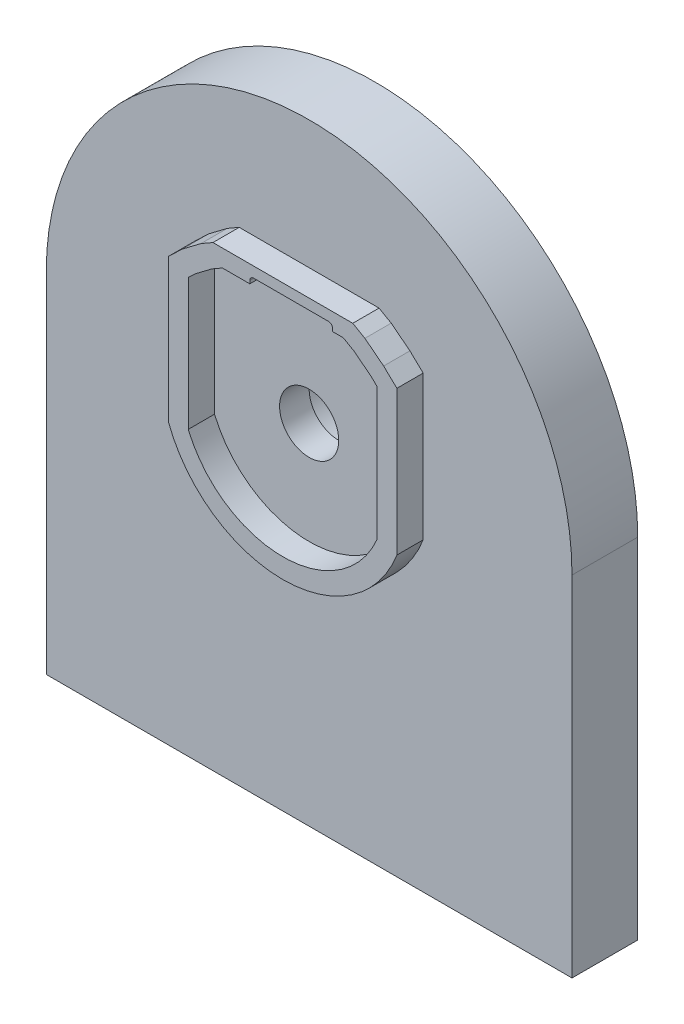
ISO-10303-21;
HEADER;
FILE_DESCRIPTION(('STEP AP214'),'2;1');
FILE_NAME('part.step','',(''),(''),'','','');
FILE_SCHEMA(('AUTOMOTIVE_DESIGN { 1 0 10303 214 1 1 1 1 }'));
ENDSEC;
DATA;
#1=APPLICATION_CONTEXT('core data for automotive mechanical design processes');
#2=APPLICATION_PROTOCOL_DEFINITION('international standard','automotive_design',2000,#1);
#3=PRODUCT_CONTEXT('',#1,'mechanical');
#4=PRODUCT('Part','Part','',(#3));
#5=PRODUCT_RELATED_PRODUCT_CATEGORY('part','',(#4));
#6=PRODUCT_DEFINITION_FORMATION('','',#4);
#7=PRODUCT_DEFINITION_CONTEXT('part definition',#1,'design');
#8=PRODUCT_DEFINITION('design','',#6,#7);
#9=PRODUCT_DEFINITION_SHAPE('','',#8);
#10=(LENGTH_UNIT() NAMED_UNIT(*) SI_UNIT(.MILLI.,.METRE.));
#11=(NAMED_UNIT(*) PLANE_ANGLE_UNIT() SI_UNIT($,.RADIAN.));
#12=(NAMED_UNIT(*) SI_UNIT($,.STERADIAN.) SOLID_ANGLE_UNIT());
#13=UNCERTAINTY_MEASURE_WITH_UNIT(LENGTH_MEASURE(1.E-05),#10,'distance_accuracy_value','');
#14=(GEOMETRIC_REPRESENTATION_CONTEXT(3) GLOBAL_UNCERTAINTY_ASSIGNED_CONTEXT((#13)) GLOBAL_UNIT_ASSIGNED_CONTEXT((#10,
#11,#12)) REPRESENTATION_CONTEXT('',''));
#15=CARTESIAN_POINT('',(0.,0.,0.));
#16=DIRECTION('',(0.,0.,1.));
#17=DIRECTION('',(1.,0.,0.));
#18=AXIS2_PLACEMENT_3D('',#15,#16,#17);
#19=CARTESIAN_POINT('',(-40.,-53.1,5.));
#20=DIRECTION('',(1.,0.,0.));
#21=DIRECTION('',(0.,0.,-1.));
#22=AXIS2_PLACEMENT_3D('',#19,#20,#21);
#23=PLANE('',#22);
#24=DIRECTION('',(0.,0.,-1.));
#25=VECTOR('',#24,1.);
#26=CARTESIAN_POINT('',(-40.,0.,9.001));
#27=LINE('',#26,#25);
#28=CARTESIAN_POINT('',(-40.,0.,5.));
#29=VERTEX_POINT('',#28);
#30=CARTESIAN_POINT('',(-40.,0.,-5.));
#31=VERTEX_POINT('',#30);
#32=EDGE_CURVE('E235',#29,#31,#27,.T.);
#33=ORIENTED_EDGE('',*,*,#32,.T.);
#34=DIRECTION('',(0.,-1.,0.));
#35=VECTOR('',#34,1.);
#36=CARTESIAN_POINT('',(-40.,-53.1,-5.));
#37=LINE('',#36,#35);
#38=CARTESIAN_POINT('',(-40.,-53.1,-5.));
#39=VERTEX_POINT('',#38);
#40=EDGE_CURVE('E246',#31,#39,#37,.T.);
#41=ORIENTED_EDGE('',*,*,#40,.T.);
#42=DIRECTION('',(0.,0.,-1.));
#43=VECTOR('',#42,1.);
#44=CARTESIAN_POINT('',(-40.,-53.1,5.));
#45=LINE('',#44,#43);
#46=CARTESIAN_POINT('',(-40.,-53.1,5.));
#47=VERTEX_POINT('',#46);
#48=EDGE_CURVE('E11',#47,#39,#45,.T.);
#49=ORIENTED_EDGE('',*,*,#48,.F.);
#50=DIRECTION('',(0.,-1.,0.));
#51=VECTOR('',#50,1.);
#52=CARTESIAN_POINT('',(-40.,-53.1,5.));
#53=LINE('',#52,#51);
#54=EDGE_CURVE('E248',#29,#47,#53,.T.);
#55=ORIENTED_EDGE('',*,*,#54,.F.);
#56=EDGE_LOOP('',(#33,#41,#49,#55));
#57=FACE_BOUND('',#56,.T.);
#58=ADVANCED_FACE('F37',(#57),#23,.F.);
#59=CARTESIAN_POINT('',(0.,0.,-5.001));
#60=DIRECTION('',(0.,0.,1.));
#61=DIRECTION('',(1.,0.,0.));
#62=AXIS2_PLACEMENT_3D('',#59,#60,#61);
#63=CYLINDRICAL_SURFACE('',#62,4.5);
#64=CARTESIAN_POINT('',(0.,0.,5.));
#65=DIRECTION('',(0.,0.,1.));
#66=DIRECTION('',(1.,0.,0.));
#67=AXIS2_PLACEMENT_3D('',#64,#65,#66);
#68=CIRCLE('',#67,4.5);
#69=CARTESIAN_POINT('',(4.5,0.,5.));
#70=VERTEX_POINT('',#69);
#71=EDGE_CURVE('E422',#70,#70,#68,.T.);
#72=ORIENTED_EDGE('',*,*,#71,.T.);
#73=EDGE_LOOP('',(#72));
#74=FACE_BOUND('',#73,.T.);
#75=CARTESIAN_POINT('',(0.,0.,0.5));
#76=DIRECTION('',(0.,0.,-1.));
#77=DIRECTION('',(-1.,0.,0.));
#78=AXIS2_PLACEMENT_3D('',#75,#76,#77);
#79=CIRCLE('',#78,4.5);
#80=CARTESIAN_POINT('',(-4.5,0.,0.5));
#81=VERTEX_POINT('',#80);
#82=EDGE_CURVE('E40',#81,#81,#79,.F.);
#83=ORIENTED_EDGE('',*,*,#82,.F.);
#84=EDGE_LOOP('',(#83));
#85=FACE_BOUND('',#84,.T.);
#86=ADVANCED_FACE('F477',(#74,#85),#63,.F.);
#87=CARTESIAN_POINT('',(0.,0.,5.));
#88=DIRECTION('',(0.,0.,1.));
#89=DIRECTION('',(1.,0.,0.));
#90=AXIS2_PLACEMENT_3D('',#87,#88,#89);
#91=PLANE('',#90);
#92=CARTESIAN_POINT('',(0.,0.,5.));
#93=DIRECTION('',(0.,0.,1.));
#94=DIRECTION('',(1.,0.,0.));
#95=AXIS2_PLACEMENT_3D('',#92,#93,#94);
#96=CIRCLE('',#95,40.);
#97=CARTESIAN_POINT('',(40.,0.,5.));
#98=VERTEX_POINT('',#97);
#99=EDGE_CURVE('E241',#98,#29,#96,.T.);
#100=ORIENTED_EDGE('',*,*,#99,.T.);
#101=ORIENTED_EDGE('',*,*,#54,.T.);
#102=DIRECTION('',(1.,0.,0.));
#103=VECTOR('',#102,1.);
#104=CARTESIAN_POINT('',(40.,-53.1,5.));
#105=LINE('',#104,#103);
#106=CARTESIAN_POINT('',(40.,-53.1,5.));
#107=VERTEX_POINT('',#106);
#108=EDGE_CURVE('E269',#47,#107,#105,.T.);
#109=ORIENTED_EDGE('',*,*,#108,.T.);
#110=DIRECTION('',(0.,1.,0.));
#111=VECTOR('',#110,1.);
#112=CARTESIAN_POINT('',(40.,-53.1,5.));
#113=LINE('',#112,#111);
#114=EDGE_CURVE('E260',#107,#98,#113,.T.);
#115=ORIENTED_EDGE('',*,*,#114,.T.);
#116=EDGE_LOOP('',(#100,#101,#109,#115));
#117=FACE_BOUND('',#116,.T.);
#118=DIRECTION('',(0.,1.,0.));
#119=VECTOR('',#118,1.);
#120=CARTESIAN_POINT('',(17.3516494747997,15.2879994287768,5.));
#121=LINE('',#120,#119);
#122=CARTESIAN_POINT('',(17.3516494747997,-6.68617710781678,5.));
#123=VERTEX_POINT('',#122);
#124=CARTESIAN_POINT('',(17.3516494747997,15.2879994287768,5.));
#125=VERTEX_POINT('',#124);
#126=EDGE_CURVE('E316',#123,#125,#121,.T.);
#127=ORIENTED_EDGE('',*,*,#126,.F.);
#128=CARTESIAN_POINT('',(0.,0.,5.));
#129=DIRECTION('',(0.,0.,1.));
#130=DIRECTION('',(1.,0.,0.));
#131=AXIS2_PLACEMENT_3D('',#128,#129,#130);
#132=CIRCLE('',#131,18.5952871398483);
#133=CARTESIAN_POINT('',(-17.395287132,-6.57181020790196,5.));
#134=VERTEX_POINT('',#133);
#135=EDGE_CURVE('E318',#134,#123,#132,.T.);
#136=ORIENTED_EDGE('',*,*,#135,.F.);
#137=DIRECTION('',(0.,-1.,0.));
#138=VECTOR('',#137,1.);
#139=CARTESIAN_POINT('',(-17.395287132,-6.57181020790196,5.));
#140=LINE('',#139,#138);
#141=CARTESIAN_POINT('',(-17.395287132,15.3071578483043,5.));
#142=VERTEX_POINT('',#141);
#143=EDGE_CURVE('E299',#142,#134,#140,.T.);
#144=ORIENTED_EDGE('',*,*,#143,.F.);
#145=DIRECTION('',(-0.723392576246225,-0.690436949063308,0.));
#146=VECTOR('',#145,1.);
#147=CARTESIAN_POINT('',(-17.395287132,15.3071578483043,5.));
#148=LINE('',#147,#146);
#149=CARTESIAN_POINT('',(-15.3110997737798,17.2963957920402,5.));
#150=VERTEX_POINT('',#149);
#151=EDGE_CURVE('E302',#150,#142,#148,.T.);
#152=ORIENTED_EDGE('',*,*,#151,.F.);
#153=DIRECTION('',(-0.797562130812441,-0.603236808802248,0.));
#154=VECTOR('',#153,1.);
#155=CARTESIAN_POINT('',(-12.4618544798575,19.4514249392361,5.));
#156=LINE('',#155,#154);
#157=CARTESIAN_POINT('',(-12.4618544798575,19.4514249392361,5.));
#158=VERTEX_POINT('',#157);
#159=EDGE_CURVE('E304',#158,#150,#156,.T.);
#160=ORIENTED_EDGE('',*,*,#159,.F.);
#161=DIRECTION('',(-0.866775184484499,-0.498699087187718,0.));
#162=VECTOR('',#161,1.);
#163=CARTESIAN_POINT('',(-12.4618544798575,19.4514249392361,5.));
#164=LINE('',#163,#162);
#165=CARTESIAN_POINT('',(-10.6393549704544,20.4999999999999,5.));
#166=VERTEX_POINT('',#165);
#167=EDGE_CURVE('E306',#166,#158,#164,.T.);
#168=ORIENTED_EDGE('',*,*,#167,.F.);
#169=DIRECTION('',(-1.,0.,0.));
#170=VECTOR('',#169,1.);
#171=CARTESIAN_POINT('',(-10.6393549704544,20.4999999999999,5.));
#172=LINE('',#171,#170);
#173=CARTESIAN_POINT('',(10.6393549672045,20.5,5.));
#174=VERTEX_POINT('',#173);
#175=EDGE_CURVE('E308',#174,#166,#172,.T.);
#176=ORIENTED_EDGE('',*,*,#175,.F.);
#177=DIRECTION('',(-0.866775184909779,0.49869908644855,0.));
#178=VECTOR('',#177,1.);
#179=CARTESIAN_POINT('',(10.6393549672045,20.5,5.));
#180=LINE('',#179,#178);
#181=CARTESIAN_POINT('',(12.4815467335809,19.4400950016231,5.));
#182=VERTEX_POINT('',#181);
#183=EDGE_CURVE('E310',#182,#174,#180,.T.);
#184=ORIENTED_EDGE('',*,*,#183,.F.);
#185=DIRECTION('',(-0.788674571599322,0.614810881582806,0.));
#186=VECTOR('',#185,1.);
#187=CARTESIAN_POINT('',(12.4815467335809,19.4400950016231,5.));
#188=LINE('',#187,#186);
#189=CARTESIAN_POINT('',(15.3346635634229,17.2159491541707,5.));
#190=VERTEX_POINT('',#189);
#191=EDGE_CURVE('E312',#190,#182,#188,.T.);
#192=ORIENTED_EDGE('',*,*,#191,.F.);
#193=DIRECTION('',(-0.722881907791822,0.690971596657384,0.));
#194=VECTOR('',#193,1.);
#195=CARTESIAN_POINT('',(15.3346635634229,17.2159491541707,5.));
#196=LINE('',#195,#194);
#197=EDGE_CURVE('E314',#125,#190,#196,.T.);
#198=ORIENTED_EDGE('',*,*,#197,.F.);
#199=EDGE_LOOP('',(#127,#136,#144,#152,#160,#168,#176,#184,#192,#198));
#200=FACE_BOUND('',#199,.T.);
#201=ADVANCED_FACE('F462',(#117,#200),#91,.T.);
#202=CARTESIAN_POINT('',(40.,-53.1,5.));
#203=DIRECTION('',(0.,1.,0.));
#204=DIRECTION('',(-1.,0.,0.));
#205=AXIS2_PLACEMENT_3D('',#202,#203,#204);
#206=PLANE('',#205);
#207=DIRECTION('',(1.,0.,0.));
#208=VECTOR('',#207,1.);
#209=CARTESIAN_POINT('',(40.,-53.1,-5.));
#210=LINE('',#209,#208);
#211=CARTESIAN_POINT('',(40.,-53.1,-5.));
#212=VERTEX_POINT('',#211);
#213=EDGE_CURVE('E252',#39,#212,#210,.T.);
#214=ORIENTED_EDGE('',*,*,#213,.T.);
#215=DIRECTION('',(0.,0.,-1.));
#216=VECTOR('',#215,1.);
#217=CARTESIAN_POINT('',(40.,-53.1,5.));
#218=LINE('',#217,#216);
#219=EDGE_CURVE('E45',#107,#212,#218,.T.);
#220=ORIENTED_EDGE('',*,*,#219,.F.);
#221=ORIENTED_EDGE('',*,*,#108,.F.);
#222=ORIENTED_EDGE('',*,*,#48,.T.);
#223=EDGE_LOOP('',(#214,#220,#221,#222));
#224=FACE_BOUND('',#223,.T.);
#225=ADVANCED_FACE('F466',(#224),#206,.F.);
#226=CARTESIAN_POINT('',(40.,-53.1,5.));
#227=DIRECTION('',(-1.,0.,0.));
#228=DIRECTION('',(0.,0.,1.));
#229=AXIS2_PLACEMENT_3D('',#226,#227,#228);
#230=PLANE('',#229);
#231=DIRECTION('',(0.,1.,0.));
#232=VECTOR('',#231,1.);
#233=CARTESIAN_POINT('',(40.,-53.1,-5.));
#234=LINE('',#233,#232);
#235=CARTESIAN_POINT('',(40.,0.,-5.));
#236=VERTEX_POINT('',#235);
#237=EDGE_CURVE('E255',#212,#236,#234,.T.);
#238=ORIENTED_EDGE('',*,*,#237,.T.);
#239=DIRECTION('',(0.,0.,-1.));
#240=VECTOR('',#239,1.);
#241=CARTESIAN_POINT('',(40.,0.,9.001));
#242=LINE('',#241,#240);
#243=EDGE_CURVE('E52',#98,#236,#242,.T.);
#244=ORIENTED_EDGE('',*,*,#243,.F.);
#245=ORIENTED_EDGE('',*,*,#114,.F.);
#246=ORIENTED_EDGE('',*,*,#219,.T.);
#247=EDGE_LOOP('',(#238,#244,#245,#246));
#248=FACE_BOUND('',#247,.T.);
#249=ADVANCED_FACE('F464',(#248),#230,.F.);
#250=CARTESIAN_POINT('',(0.,0.,-5.));
#251=DIRECTION('',(0.,0.,1.));
#252=DIRECTION('',(1.,0.,0.));
#253=AXIS2_PLACEMENT_3D('',#250,#251,#252);
#254=PLANE('',#253);
#255=CARTESIAN_POINT('',(0.,0.,-5.));
#256=DIRECTION('',(0.,0.,-1.));
#257=DIRECTION('',(-1.,0.,0.));
#258=AXIS2_PLACEMENT_3D('',#255,#256,#257);
#259=CIRCLE('',#258,7.75);
#260=CARTESIAN_POINT('',(-7.75,0.,-5.));
#261=VERTEX_POINT('',#260);
#262=EDGE_CURVE('E249',#261,#261,#259,.T.);
#263=ORIENTED_EDGE('',*,*,#262,.F.);
#264=EDGE_LOOP('',(#263));
#265=FACE_BOUND('',#264,.T.);
#266=ORIENTED_EDGE('',*,*,#40,.F.);
#267=CARTESIAN_POINT('',(0.,0.,-5.));
#268=DIRECTION('',(0.,0.,1.));
#269=DIRECTION('',(1.,0.,0.));
#270=AXIS2_PLACEMENT_3D('',#267,#268,#269);
#271=CIRCLE('',#270,40.);
#272=EDGE_CURVE('E232',#236,#31,#271,.T.);
#273=ORIENTED_EDGE('',*,*,#272,.F.);
#274=ORIENTED_EDGE('',*,*,#237,.F.);
#275=ORIENTED_EDGE('',*,*,#213,.F.);
#276=EDGE_LOOP('',(#266,#273,#274,#275));
#277=FACE_BOUND('',#276,.T.);
#278=ADVANCED_FACE('F251',(#265,#277),#254,.F.);
#279=CARTESIAN_POINT('',(0.,0.,9.));
#280=DIRECTION('',(0.,0.,1.));
#281=DIRECTION('',(1.,0.,0.));
#282=AXIS2_PLACEMENT_3D('',#279,#280,#281);
#283=PLANE('',#282);
#284=CARTESIAN_POINT('',(0.,0.,9.));
#285=DIRECTION('',(0.,0.,1.));
#286=DIRECTION('',(1.,0.,0.));
#287=AXIS2_PLACEMENT_3D('',#284,#285,#286);
#288=CIRCLE('',#287,18.5952871398483);
#289=CARTESIAN_POINT('',(-17.395287132,-6.57181020790196,9.));
#290=VERTEX_POINT('',#289);
#291=CARTESIAN_POINT('',(17.3516494747997,-6.68617710781678,9.));
#292=VERTEX_POINT('',#291);
#293=EDGE_CURVE('E301',#290,#292,#288,.T.);
#294=ORIENTED_EDGE('',*,*,#293,.T.);
#295=DIRECTION('',(0.,1.,0.));
#296=VECTOR('',#295,1.);
#297=CARTESIAN_POINT('',(17.3516494747997,15.2879994287768,9.));
#298=LINE('',#297,#296);
#299=CARTESIAN_POINT('',(17.3516494747997,15.2879994287768,9.));
#300=VERTEX_POINT('',#299);
#301=EDGE_CURVE('E337',#292,#300,#298,.T.);
#302=ORIENTED_EDGE('',*,*,#301,.T.);
#303=DIRECTION('',(-0.722881907791822,0.690971596657384,0.));
#304=VECTOR('',#303,1.);
#305=CARTESIAN_POINT('',(15.3346635634229,17.2159491541707,9.));
#306=LINE('',#305,#304);
#307=CARTESIAN_POINT('',(15.3346635634229,17.2159491541707,9.));
#308=VERTEX_POINT('',#307);
#309=EDGE_CURVE('E335',#300,#308,#306,.T.);
#310=ORIENTED_EDGE('',*,*,#309,.T.);
#311=DIRECTION('',(-0.788674571599322,0.614810881582806,0.));
#312=VECTOR('',#311,1.);
#313=CARTESIAN_POINT('',(12.4815467335809,19.4400950016231,9.));
#314=LINE('',#313,#312);
#315=CARTESIAN_POINT('',(12.4815467335809,19.4400950016231,9.));
#316=VERTEX_POINT('',#315);
#317=EDGE_CURVE('E333',#308,#316,#314,.T.);
#318=ORIENTED_EDGE('',*,*,#317,.T.);
#319=DIRECTION('',(-0.866775184909779,0.49869908644855,0.));
#320=VECTOR('',#319,1.);
#321=CARTESIAN_POINT('',(10.6393549672045,20.5,9.));
#322=LINE('',#321,#320);
#323=CARTESIAN_POINT('',(10.6393549672045,20.5,9.));
#324=VERTEX_POINT('',#323);
#325=EDGE_CURVE('E331',#316,#324,#322,.T.);
#326=ORIENTED_EDGE('',*,*,#325,.T.);
#327=DIRECTION('',(-1.,0.,0.));
#328=VECTOR('',#327,1.);
#329=CARTESIAN_POINT('',(-10.6393549704544,20.4999999999999,9.));
#330=LINE('',#329,#328);
#331=CARTESIAN_POINT('',(-10.6393549704544,20.4999999999999,9.));
#332=VERTEX_POINT('',#331);
#333=EDGE_CURVE('E329',#324,#332,#330,.T.);
#334=ORIENTED_EDGE('',*,*,#333,.T.);
#335=DIRECTION('',(-0.866775184484499,-0.498699087187718,0.));
#336=VECTOR('',#335,1.);
#337=CARTESIAN_POINT('',(-12.4618544798575,19.4514249392361,9.));
#338=LINE('',#337,#336);
#339=CARTESIAN_POINT('',(-12.4618544798575,19.4514249392361,9.));
#340=VERTEX_POINT('',#339);
#341=EDGE_CURVE('E327',#332,#340,#338,.T.);
#342=ORIENTED_EDGE('',*,*,#341,.T.);
#343=DIRECTION('',(-0.797562130812441,-0.603236808802248,0.));
#344=VECTOR('',#343,1.);
#345=CARTESIAN_POINT('',(-12.4618544798575,19.4514249392361,9.));
#346=LINE('',#345,#344);
#347=CARTESIAN_POINT('',(-15.3110997737798,17.2963957920402,9.));
#348=VERTEX_POINT('',#347);
#349=EDGE_CURVE('E325',#340,#348,#346,.T.);
#350=ORIENTED_EDGE('',*,*,#349,.T.);
#351=DIRECTION('',(-0.723392576246225,-0.690436949063308,0.));
#352=VECTOR('',#351,1.);
#353=CARTESIAN_POINT('',(-17.395287132,15.3071578483043,9.));
#354=LINE('',#353,#352);
#355=CARTESIAN_POINT('',(-17.395287132,15.3071578483043,9.));
#356=VERTEX_POINT('',#355);
#357=EDGE_CURVE('E323',#348,#356,#354,.T.);
#358=ORIENTED_EDGE('',*,*,#357,.T.);
#359=DIRECTION('',(0.,-1.,0.));
#360=VECTOR('',#359,1.);
#361=CARTESIAN_POINT('',(-17.395287132,-6.57181020790196,9.));
#362=LINE('',#361,#360);
#363=EDGE_CURVE('E298',#356,#290,#362,.T.);
#364=ORIENTED_EDGE('',*,*,#363,.T.);
#365=EDGE_LOOP('',(#294,#302,#310,#318,#326,#334,#342,#350,#358,#364));
#366=FACE_BOUND('',#365,.T.);
#367=DIRECTION('',(0.,1.,0.));
#368=VECTOR('',#367,1.);
#369=CARTESIAN_POINT('',(14.3516494747997,14.0055144197664,9.));
#370=LINE('',#369,#368);
#371=CARTESIAN_POINT('',(14.3516494747997,-6.10271565180623,9.));
#372=VERTEX_POINT('',#371);
#373=CARTESIAN_POINT('',(14.3516494747997,14.0055144197664,9.));
#374=VERTEX_POINT('',#373);
#375=EDGE_CURVE('E451',#372,#374,#370,.T.);
#376=ORIENTED_EDGE('',*,*,#375,.F.);
#377=CARTESIAN_POINT('',(0.,0.,9.));
#378=DIRECTION('',(0.,0.,1.));
#379=DIRECTION('',(1.,0.,0.));
#380=AXIS2_PLACEMENT_3D('',#377,#378,#379);
#381=CIRCLE('',#380,15.5952871398484);
#382=CARTESIAN_POINT('',(-14.395287132,-5.99905737275405,9.));
#383=VERTEX_POINT('',#382);
#384=EDGE_CURVE('E391',#383,#372,#381,.T.);
#385=ORIENTED_EDGE('',*,*,#384,.F.);
#386=DIRECTION('',(0.,-1.,0.));
#387=VECTOR('',#386,1.);
#388=CARTESIAN_POINT('',(-14.395287132,-5.99905737275405,9.));
#389=LINE('',#388,#387);
#390=CARTESIAN_POINT('',(-14.395287132,14.02336094009,9.));
#391=VERTEX_POINT('',#390);
#392=EDGE_CURVE('E388',#391,#383,#389,.T.);
#393=ORIENTED_EDGE('',*,*,#392,.F.);
#394=DIRECTION('',(-0.723392576246216,-0.690436949063318,0.));
#395=VECTOR('',#394,1.);
#396=CARTESIAN_POINT('',(-14.395287132,14.02336094009,9.));
#397=LINE('',#396,#395);
#398=CARTESIAN_POINT('',(-13.3642106476702,15.0074646280014,9.));
#399=VERTEX_POINT('',#398);
#400=EDGE_CURVE('E424',#399,#391,#397,.T.);
#401=ORIENTED_EDGE('',*,*,#400,.F.);
#402=DIRECTION('',(-0.797562130812442,-0.603236808802245,0.));
#403=VECTOR('',#402,1.);
#404=CARTESIAN_POINT('',(-10.8024296846773,16.9450698793841,9.));
#405=LINE('',#404,#403);
#406=CARTESIAN_POINT('',(-10.8024296846773,16.9450698793841,9.));
#407=VERTEX_POINT('',#406);
#408=EDGE_CURVE('E427',#407,#399,#405,.T.);
#409=ORIENTED_EDGE('',*,*,#408,.F.);
#410=DIRECTION('',(-0.866775184484492,-0.498699087187729,0.));
#411=VECTOR('',#410,1.);
#412=CARTESIAN_POINT('',(-10.8024296846773,16.9450698793841,9.));
#413=LINE('',#412,#411);
#414=CARTESIAN_POINT('',(-9.20235605248733,17.8656722155953,9.));
#415=VERTEX_POINT('',#414);
#416=EDGE_CURVE('E429',#415,#407,#413,.T.);
#417=ORIENTED_EDGE('',*,*,#416,.F.);
#418=DIRECTION('',(-1.,0.,0.));
#419=VECTOR('',#418,1.);
#420=CARTESIAN_POINT('',(-9.20235605248733,17.8656722155953,9.));
#421=LINE('',#420,#419);
#422=CARTESIAN_POINT('',(-5.02528712683671,17.8656722155953,9.));
#423=VERTEX_POINT('',#422);
#424=EDGE_CURVE('E431',#423,#415,#421,.T.);
#425=ORIENTED_EDGE('',*,*,#424,.F.);
#426=DIRECTION('',(0.,-1.,0.));
#427=VECTOR('',#426,1.);
#428=CARTESIAN_POINT('',(-5.02528712683671,17.8656722155953,9.));
#429=LINE('',#428,#427);
#430=CARTESIAN_POINT('',(-5.02528712683671,18.3079082550131,9.));
#431=VERTEX_POINT('',#430);
#432=EDGE_CURVE('E433',#431,#423,#429,.T.);
#433=ORIENTED_EDGE('',*,*,#432,.F.);
#434=CARTESIAN_POINT('',(-4.43010720618557,18.3079082550131,9.));
#435=DIRECTION('',(0.,0.,1.));
#436=DIRECTION('',(-1.,0.,0.));
#437=AXIS2_PLACEMENT_3D('',#434,#435,#436);
#438=CIRCLE('',#437,0.595179920651143);
#439=CARTESIAN_POINT('',(-4.43010720618557,18.9030881756642,9.));
#440=VERTEX_POINT('',#439);
#441=EDGE_CURVE('E435',#440,#431,#438,.T.);
#442=ORIENTED_EDGE('',*,*,#441,.F.);
#443=DIRECTION('',(-1.,0.,0.));
#444=VECTOR('',#443,1.);
#445=CARTESIAN_POINT('',(-4.43010720618557,18.9030881756642,9.));
#446=LINE('',#445,#444);
#447=CARTESIAN_POINT('',(6.97010720783005,18.9030881756642,9.));
#448=VERTEX_POINT('',#447);
#449=EDGE_CURVE('E437',#448,#440,#446,.T.);
#450=ORIENTED_EDGE('',*,*,#449,.F.);
#451=CARTESIAN_POINT('',(6.97010720783004,18.3079082554086,9.));
#452=DIRECTION('',(0.,0.,1.));
#453=DIRECTION('',(-1.,0.,0.));
#454=AXIS2_PLACEMENT_3D('',#451,#452,#453);
#455=CIRCLE('',#454,0.595179920255596);
#456=CARTESIAN_POINT('',(7.56528712808564,18.3079082554086,9.));
#457=VERTEX_POINT('',#456);
#458=EDGE_CURVE('E439',#457,#448,#455,.T.);
#459=ORIENTED_EDGE('',*,*,#458,.F.);
#460=DIRECTION('',(-1.17678568895622E-13,1.,0.));
#461=VECTOR('',#460,1.);
#462=CARTESIAN_POINT('',(7.56528712808564,18.3079082554086,9.));
#463=LINE('',#462,#461);
#464=CARTESIAN_POINT('',(7.56528712808569,17.8656722155953,9.));
#465=VERTEX_POINT('',#464);
#466=EDGE_CURVE('E441',#465,#457,#463,.T.);
#467=ORIENTED_EDGE('',*,*,#466,.F.);
#468=DIRECTION('',(-1.,0.,0.));
#469=VECTOR('',#468,1.);
#470=CARTESIAN_POINT('',(7.56528712808569,17.8656722155953,9.));
#471=LINE('',#470,#469);
#472=CARTESIAN_POINT('',(9.20235604935411,17.8656722155953,9.));
#473=VERTEX_POINT('',#472);
#474=EDGE_CURVE('E443',#473,#465,#471,.T.);
#475=ORIENTED_EDGE('',*,*,#474,.F.);
#476=DIRECTION('',(-0.86677518490977,0.498699086448565,0.));
#477=VECTOR('',#476,1.);
#478=CARTESIAN_POINT('',(9.20235604935411,17.8656722155953,9.));
#479=LINE('',#478,#477);
#480=CARTESIAN_POINT('',(10.803064918675,16.9447043975289,9.));
#481=VERTEX_POINT('',#480);
#482=EDGE_CURVE('E445',#481,#473,#479,.T.);
#483=ORIENTED_EDGE('',*,*,#482,.F.);
#484=DIRECTION('',(-0.788674571599326,0.614810881582801,0.));
#485=VECTOR('',#484,1.);
#486=CARTESIAN_POINT('',(10.803064918675,16.9447043975289,9.));
#487=LINE('',#486,#485);
#488=CARTESIAN_POINT('',(13.37101733952,14.9428583274562,9.));
#489=VERTEX_POINT('',#488);
#490=EDGE_CURVE('E447',#489,#481,#487,.T.);
#491=ORIENTED_EDGE('',*,*,#490,.F.);
#492=DIRECTION('',(-0.722881907791822,0.690971596657385,0.));
#493=VECTOR('',#492,1.);
#494=CARTESIAN_POINT('',(13.37101733952,14.9428583274562,9.));
#495=LINE('',#494,#493);
#496=EDGE_CURVE('E449',#374,#489,#495,.T.);
#497=ORIENTED_EDGE('',*,*,#496,.F.);
#498=EDGE_LOOP('',(#376,#385,#393,#401,#409,#417,#425,#433,#442,#450,#459,#467,#475,#483,#491,#497));
#499=FACE_BOUND('',#498,.T.);
#500=ADVANCED_FACE('F472',(#366,#499),#283,.T.);
#501=CARTESIAN_POINT('',(0.,0.,9.));
#502=DIRECTION('',(0.,0.,-1.));
#503=DIRECTION('',(-1.,0.,0.));
#504=AXIS2_PLACEMENT_3D('',#501,#502,#503);
#505=CYLINDRICAL_SURFACE('',#504,18.5952871398483);
#506=ORIENTED_EDGE('',*,*,#135,.T.);
#507=DIRECTION('',(0.,0.,-1.));
#508=VECTOR('',#507,1.);
#509=CARTESIAN_POINT('',(17.3516494747997,-6.68617710781678,9.));
#510=LINE('',#509,#508);
#511=EDGE_CURVE('E253',#292,#123,#510,.T.);
#512=ORIENTED_EDGE('',*,*,#511,.F.);
#513=ORIENTED_EDGE('',*,*,#293,.F.);
#514=DIRECTION('',(0.,0.,-1.));
#515=VECTOR('',#514,1.);
#516=CARTESIAN_POINT('',(-17.395287132,-6.57181020790196,9.));
#517=LINE('',#516,#515);
#518=EDGE_CURVE('E295',#290,#134,#517,.T.);
#519=ORIENTED_EDGE('',*,*,#518,.T.);
#520=EDGE_LOOP('',(#506,#512,#513,#519));
#521=FACE_BOUND('',#520,.T.);
#522=ADVANCED_FACE('F560',(#521),#505,.T.);
#523=CARTESIAN_POINT('',(17.3516494747997,15.2879994287768,9.));
#524=DIRECTION('',(-1.,0.,0.));
#525=DIRECTION('',(0.,0.,1.));
#526=AXIS2_PLACEMENT_3D('',#523,#524,#525);
#527=PLANE('',#526);
#528=ORIENTED_EDGE('',*,*,#126,.T.);
#529=DIRECTION('',(0.,0.,-1.));
#530=VECTOR('',#529,1.);
#531=CARTESIAN_POINT('',(17.3516494747997,15.2879994287768,9.));
#532=LINE('',#531,#530);
#533=EDGE_CURVE('E257',#300,#125,#532,.T.);
#534=ORIENTED_EDGE('',*,*,#533,.F.);
#535=ORIENTED_EDGE('',*,*,#301,.F.);
#536=ORIENTED_EDGE('',*,*,#511,.T.);
#537=EDGE_LOOP('',(#528,#534,#535,#536));
#538=FACE_BOUND('',#537,.T.);
#539=ADVANCED_FACE('F591',(#538),#527,.F.);
#540=CARTESIAN_POINT('',(15.3346635634229,17.2159491541707,9.));
#541=DIRECTION('',(-0.690971596657384,-0.722881907791823,0.));
#542=DIRECTION('',(0.722881907791823,-0.690971596657384,0.));
#543=AXIS2_PLACEMENT_3D('',#540,#541,#542);
#544=PLANE('',#543);
#545=ORIENTED_EDGE('',*,*,#197,.T.);
#546=DIRECTION('',(0.,0.,-1.));
#547=VECTOR('',#546,1.);
#548=CARTESIAN_POINT('',(15.3346635634229,17.2159491541707,9.));
#549=LINE('',#548,#547);
#550=EDGE_CURVE('E276',#308,#190,#549,.T.);
#551=ORIENTED_EDGE('',*,*,#550,.F.);
#552=ORIENTED_EDGE('',*,*,#309,.F.);
#553=ORIENTED_EDGE('',*,*,#533,.T.);
#554=EDGE_LOOP('',(#545,#551,#552,#553));
#555=FACE_BOUND('',#554,.T.);
#556=ADVANCED_FACE('F587',(#555),#544,.F.);
#557=CARTESIAN_POINT('',(12.4815467335809,19.4400950016231,9.));
#558=DIRECTION('',(-0.614810881582806,-0.788674571599322,0.));
#559=DIRECTION('',(0.788674571599322,-0.614810881582806,0.));
#560=AXIS2_PLACEMENT_3D('',#557,#558,#559);
#561=PLANE('',#560);
#562=ORIENTED_EDGE('',*,*,#191,.T.);
#563=DIRECTION('',(0.,0.,-1.));
#564=VECTOR('',#563,1.);
#565=CARTESIAN_POINT('',(12.4815467335809,19.4400950016231,9.));
#566=LINE('',#565,#564);
#567=EDGE_CURVE('E279',#316,#182,#566,.T.);
#568=ORIENTED_EDGE('',*,*,#567,.F.);
#569=ORIENTED_EDGE('',*,*,#317,.F.);
#570=ORIENTED_EDGE('',*,*,#550,.T.);
#571=EDGE_LOOP('',(#562,#568,#569,#570));
#572=FACE_BOUND('',#571,.T.);
#573=ADVANCED_FACE('F583',(#572),#561,.F.);
#574=CARTESIAN_POINT('',(10.6393549672045,20.5,9.));
#575=DIRECTION('',(-0.49869908644855,-0.866775184909779,0.));
#576=DIRECTION('',(0.866775184909779,-0.49869908644855,0.));
#577=AXIS2_PLACEMENT_3D('',#574,#575,#576);
#578=PLANE('',#577);
#579=ORIENTED_EDGE('',*,*,#183,.T.);
#580=DIRECTION('',(0.,0.,-1.));
#581=VECTOR('',#580,1.);
#582=CARTESIAN_POINT('',(10.6393549672045,20.5,9.));
#583=LINE('',#582,#581);
#584=EDGE_CURVE('E282',#324,#174,#583,.T.);
#585=ORIENTED_EDGE('',*,*,#584,.F.);
#586=ORIENTED_EDGE('',*,*,#325,.F.);
#587=ORIENTED_EDGE('',*,*,#567,.T.);
#588=EDGE_LOOP('',(#579,#585,#586,#587));
#589=FACE_BOUND('',#588,.T.);
#590=ADVANCED_FACE('F579',(#589),#578,.F.);
#591=CARTESIAN_POINT('',(-10.6393549704544,20.4999999999999,9.));
#592=DIRECTION('',(0.,-1.,0.));
#593=DIRECTION('',(1.,0.,0.));
#594=AXIS2_PLACEMENT_3D('',#591,#592,#593);
#595=PLANE('',#594);
#596=ORIENTED_EDGE('',*,*,#175,.T.);
#597=DIRECTION('',(0.,0.,-1.));
#598=VECTOR('',#597,1.);
#599=CARTESIAN_POINT('',(-10.6393549704544,20.4999999999999,9.));
#600=LINE('',#599,#598);
#601=EDGE_CURVE('E285',#332,#166,#600,.T.);
#602=ORIENTED_EDGE('',*,*,#601,.F.);
#603=ORIENTED_EDGE('',*,*,#333,.F.);
#604=ORIENTED_EDGE('',*,*,#584,.T.);
#605=EDGE_LOOP('',(#596,#602,#603,#604));
#606=FACE_BOUND('',#605,.T.);
#607=ADVANCED_FACE('F575',(#606),#595,.F.);
#608=CARTESIAN_POINT('',(-12.4618544798575,19.4514249392361,9.));
#609=DIRECTION('',(0.498699087187718,-0.866775184484499,0.));
#610=DIRECTION('',(0.866775184484499,0.498699087187718,0.));
#611=AXIS2_PLACEMENT_3D('',#608,#609,#610);
#612=PLANE('',#611);
#613=ORIENTED_EDGE('',*,*,#167,.T.);
#614=DIRECTION('',(0.,0.,-1.));
#615=VECTOR('',#614,1.);
#616=CARTESIAN_POINT('',(-12.4618544798575,19.4514249392361,9.));
#617=LINE('',#616,#615);
#618=EDGE_CURVE('E288',#340,#158,#617,.T.);
#619=ORIENTED_EDGE('',*,*,#618,.F.);
#620=ORIENTED_EDGE('',*,*,#341,.F.);
#621=ORIENTED_EDGE('',*,*,#601,.T.);
#622=EDGE_LOOP('',(#613,#619,#620,#621));
#623=FACE_BOUND('',#622,.T.);
#624=ADVANCED_FACE('F571',(#623),#612,.F.);
#625=CARTESIAN_POINT('',(-12.4618544798575,19.4514249392361,9.));
#626=DIRECTION('',(0.603236808802248,-0.797562130812441,0.));
#627=DIRECTION('',(0.797562130812441,0.603236808802248,0.));
#628=AXIS2_PLACEMENT_3D('',#625,#626,#627);
#629=PLANE('',#628);
#630=ORIENTED_EDGE('',*,*,#159,.T.);
#631=DIRECTION('',(0.,0.,-1.));
#632=VECTOR('',#631,1.);
#633=CARTESIAN_POINT('',(-15.3110997737798,17.2963957920402,9.));
#634=LINE('',#633,#632);
#635=EDGE_CURVE('E291',#348,#150,#634,.T.);
#636=ORIENTED_EDGE('',*,*,#635,.F.);
#637=ORIENTED_EDGE('',*,*,#349,.F.);
#638=ORIENTED_EDGE('',*,*,#618,.T.);
#639=EDGE_LOOP('',(#630,#636,#637,#638));
#640=FACE_BOUND('',#639,.T.);
#641=ADVANCED_FACE('F567',(#640),#629,.F.);
#642=CARTESIAN_POINT('',(-17.395287132,15.3071578483043,9.));
#643=DIRECTION('',(0.690436949063308,-0.723392576246225,0.));
#644=DIRECTION('',(0.723392576246225,0.690436949063308,0.));
#645=AXIS2_PLACEMENT_3D('',#642,#643,#644);
#646=PLANE('',#645);
#647=ORIENTED_EDGE('',*,*,#151,.T.);
#648=DIRECTION('',(0.,0.,-1.));
#649=VECTOR('',#648,1.);
#650=CARTESIAN_POINT('',(-17.395287132,15.3071578483043,9.));
#651=LINE('',#650,#649);
#652=EDGE_CURVE('E60',#356,#142,#651,.T.);
#653=ORIENTED_EDGE('',*,*,#652,.F.);
#654=ORIENTED_EDGE('',*,*,#357,.F.);
#655=ORIENTED_EDGE('',*,*,#635,.T.);
#656=EDGE_LOOP('',(#647,#653,#654,#655));
#657=FACE_BOUND('',#656,.T.);
#658=ADVANCED_FACE('F564',(#657),#646,.F.);
#659=CARTESIAN_POINT('',(-17.395287132,-6.57181020790196,9.));
#660=DIRECTION('',(1.,0.,0.));
#661=DIRECTION('',(0.,0.,-1.));
#662=AXIS2_PLACEMENT_3D('',#659,#660,#661);
#663=PLANE('',#662);
#664=ORIENTED_EDGE('',*,*,#143,.T.);
#665=ORIENTED_EDGE('',*,*,#518,.F.);
#666=ORIENTED_EDGE('',*,*,#363,.F.);
#667=ORIENTED_EDGE('',*,*,#652,.T.);
#668=EDGE_LOOP('',(#664,#665,#666,#667));
#669=FACE_BOUND('',#668,.T.);
#670=ADVANCED_FACE('F556',(#669),#663,.F.);
#671=CARTESIAN_POINT('',(0.,0.,9.));
#672=DIRECTION('',(0.,0.,-1.));
#673=DIRECTION('',(-1.,0.,0.));
#674=AXIS2_PLACEMENT_3D('',#671,#672,#673);
#675=CYLINDRICAL_SURFACE('',#674,15.5952871398484);
#676=CARTESIAN_POINT('',(0.,0.,5.));
#677=DIRECTION('',(0.,0.,1.));
#678=DIRECTION('',(1.,0.,0.));
#679=AXIS2_PLACEMENT_3D('',#676,#677,#678);
#680=CIRCLE('',#679,15.5952871398484);
#681=CARTESIAN_POINT('',(-14.395287132,-5.99905737275405,5.));
#682=VERTEX_POINT('',#681);
#683=CARTESIAN_POINT('',(14.3516494747997,-6.10271565180623,5.));
#684=VERTEX_POINT('',#683);
#685=EDGE_CURVE('E420',#682,#684,#680,.T.);
#686=ORIENTED_EDGE('',*,*,#685,.F.);
#687=DIRECTION('',(0.,0.,-1.));
#688=VECTOR('',#687,1.);
#689=CARTESIAN_POINT('',(-14.395287132,-5.99905737275405,9.));
#690=LINE('',#689,#688);
#691=EDGE_CURVE('E385',#383,#682,#690,.T.);
#692=ORIENTED_EDGE('',*,*,#691,.F.);
#693=ORIENTED_EDGE('',*,*,#384,.T.);
#694=DIRECTION('',(0.,0.,-1.));
#695=VECTOR('',#694,1.);
#696=CARTESIAN_POINT('',(14.3516494747997,-6.10271565180623,9.));
#697=LINE('',#696,#695);
#698=EDGE_CURVE('E321',#372,#684,#697,.T.);
#699=ORIENTED_EDGE('',*,*,#698,.T.);
#700=EDGE_LOOP('',(#686,#692,#693,#699));
#701=FACE_BOUND('',#700,.T.);
#702=ADVANCED_FACE('F552',(#701),#675,.F.);
#703=CARTESIAN_POINT('',(14.3516494747997,14.0055144197664,9.));
#704=DIRECTION('',(-1.,0.,0.));
#705=DIRECTION('',(0.,0.,1.));
#706=AXIS2_PLACEMENT_3D('',#703,#704,#705);
#707=PLANE('',#706);
#708=DIRECTION('',(0.,1.,0.));
#709=VECTOR('',#708,1.);
#710=CARTESIAN_POINT('',(14.3516494747997,14.0055144197664,5.));
#711=LINE('',#710,#709);
#712=CARTESIAN_POINT('',(14.3516494747997,14.0055144197664,5.));
#713=VERTEX_POINT('',#712);
#714=EDGE_CURVE('E418',#684,#713,#711,.T.);
#715=ORIENTED_EDGE('',*,*,#714,.F.);
#716=ORIENTED_EDGE('',*,*,#698,.F.);
#717=ORIENTED_EDGE('',*,*,#375,.T.);
#718=DIRECTION('',(0.,0.,-1.));
#719=VECTOR('',#718,1.);
#720=CARTESIAN_POINT('',(14.3516494747997,14.0055144197664,9.));
#721=LINE('',#720,#719);
#722=EDGE_CURVE('E343',#374,#713,#721,.T.);
#723=ORIENTED_EDGE('',*,*,#722,.T.);
#724=EDGE_LOOP('',(#715,#716,#717,#723));
#725=FACE_BOUND('',#724,.T.);
#726=ADVANCED_FACE('F548',(#725),#707,.T.);
#727=CARTESIAN_POINT('',(13.37101733952,14.9428583274562,9.));
#728=DIRECTION('',(-0.690971596657385,-0.722881907791822,0.));
#729=DIRECTION('',(0.722881907791822,-0.690971596657385,0.));
#730=AXIS2_PLACEMENT_3D('',#727,#728,#729);
#731=PLANE('',#730);
#732=DIRECTION('',(-0.722881907791822,0.690971596657385,0.));
#733=VECTOR('',#732,1.);
#734=CARTESIAN_POINT('',(13.37101733952,14.9428583274562,5.));
#735=LINE('',#734,#733);
#736=CARTESIAN_POINT('',(13.37101733952,14.9428583274562,5.));
#737=VERTEX_POINT('',#736);
#738=EDGE_CURVE('E416',#713,#737,#735,.T.);
#739=ORIENTED_EDGE('',*,*,#738,.F.);
#740=ORIENTED_EDGE('',*,*,#722,.F.);
#741=ORIENTED_EDGE('',*,*,#496,.T.);
#742=DIRECTION('',(0.,0.,-1.));
#743=VECTOR('',#742,1.);
#744=CARTESIAN_POINT('',(13.37101733952,14.9428583274562,9.));
#745=LINE('',#744,#743);
#746=EDGE_CURVE('E346',#489,#737,#745,.T.);
#747=ORIENTED_EDGE('',*,*,#746,.T.);
#748=EDGE_LOOP('',(#739,#740,#741,#747));
#749=FACE_BOUND('',#748,.T.);
#750=ADVANCED_FACE('F544',(#749),#731,.T.);
#751=CARTESIAN_POINT('',(10.803064918675,16.9447043975289,9.));
#752=DIRECTION('',(-0.614810881582801,-0.788674571599326,0.));
#753=DIRECTION('',(0.788674571599326,-0.614810881582801,0.));
#754=AXIS2_PLACEMENT_3D('',#751,#752,#753);
#755=PLANE('',#754);
#756=DIRECTION('',(-0.788674571599326,0.614810881582801,0.));
#757=VECTOR('',#756,1.);
#758=CARTESIAN_POINT('',(10.803064918675,16.9447043975289,5.));
#759=LINE('',#758,#757);
#760=CARTESIAN_POINT('',(10.803064918675,16.9447043975289,5.));
#761=VERTEX_POINT('',#760);
#762=EDGE_CURVE('E414',#737,#761,#759,.T.);
#763=ORIENTED_EDGE('',*,*,#762,.F.);
#764=ORIENTED_EDGE('',*,*,#746,.F.);
#765=ORIENTED_EDGE('',*,*,#490,.T.);
#766=DIRECTION('',(0.,0.,-1.));
#767=VECTOR('',#766,1.);
#768=CARTESIAN_POINT('',(10.803064918675,16.9447043975289,9.));
#769=LINE('',#768,#767);
#770=EDGE_CURVE('E349',#481,#761,#769,.T.);
#771=ORIENTED_EDGE('',*,*,#770,.T.);
#772=EDGE_LOOP('',(#763,#764,#765,#771));
#773=FACE_BOUND('',#772,.T.);
#774=ADVANCED_FACE('F540',(#773),#755,.T.);
#775=CARTESIAN_POINT('',(9.20235604935411,17.8656722155953,9.));
#776=DIRECTION('',(-0.498699086448565,-0.86677518490977,0.));
#777=DIRECTION('',(0.86677518490977,-0.498699086448565,0.));
#778=AXIS2_PLACEMENT_3D('',#775,#776,#777);
#779=PLANE('',#778);
#780=DIRECTION('',(-0.86677518490977,0.498699086448565,0.));
#781=VECTOR('',#780,1.);
#782=CARTESIAN_POINT('',(9.20235604935411,17.8656722155953,5.));
#783=LINE('',#782,#781);
#784=CARTESIAN_POINT('',(9.20235604935411,17.8656722155953,5.));
#785=VERTEX_POINT('',#784);
#786=EDGE_CURVE('E412',#761,#785,#783,.T.);
#787=ORIENTED_EDGE('',*,*,#786,.F.);
#788=ORIENTED_EDGE('',*,*,#770,.F.);
#789=ORIENTED_EDGE('',*,*,#482,.T.);
#790=DIRECTION('',(0.,0.,-1.));
#791=VECTOR('',#790,1.);
#792=CARTESIAN_POINT('',(9.20235604935411,17.8656722155953,9.));
#793=LINE('',#792,#791);
#794=EDGE_CURVE('E352',#473,#785,#793,.T.);
#795=ORIENTED_EDGE('',*,*,#794,.T.);
#796=EDGE_LOOP('',(#787,#788,#789,#795));
#797=FACE_BOUND('',#796,.T.);
#798=ADVANCED_FACE('F536',(#797),#779,.T.);
#799=CARTESIAN_POINT('',(7.56528712808569,17.8656722155953,9.));
#800=DIRECTION('',(0.,-1.,0.));
#801=DIRECTION('',(0.,0.,-1.));
#802=AXIS2_PLACEMENT_3D('',#799,#800,#801);
#803=PLANE('',#802);
#804=DIRECTION('',(-1.,0.,0.));
#805=VECTOR('',#804,1.);
#806=CARTESIAN_POINT('',(7.56528712808569,17.8656722155953,5.));
#807=LINE('',#806,#805);
#808=CARTESIAN_POINT('',(7.56528712808569,17.8656722155953,5.));
#809=VERTEX_POINT('',#808);
#810=EDGE_CURVE('E410',#785,#809,#807,.T.);
#811=ORIENTED_EDGE('',*,*,#810,.F.);
#812=ORIENTED_EDGE('',*,*,#794,.F.);
#813=ORIENTED_EDGE('',*,*,#474,.T.);
#814=DIRECTION('',(0.,0.,-1.));
#815=VECTOR('',#814,1.);
#816=CARTESIAN_POINT('',(7.56528712808569,17.8656722155953,9.));
#817=LINE('',#816,#815);
#818=EDGE_CURVE('E355',#465,#809,#817,.T.);
#819=ORIENTED_EDGE('',*,*,#818,.T.);
#820=EDGE_LOOP('',(#811,#812,#813,#819));
#821=FACE_BOUND('',#820,.T.);
#822=ADVANCED_FACE('F532',(#821),#803,.T.);
#823=CARTESIAN_POINT('',(7.56528712808564,18.3079082554086,9.));
#824=DIRECTION('',(-1.,-1.17678568895622E-13,0.));
#825=DIRECTION('',(1.17678568895622E-13,-1.,0.));
#826=AXIS2_PLACEMENT_3D('',#823,#824,#825);
#827=PLANE('',#826);
#828=DIRECTION('',(-1.17678568895622E-13,1.,0.));
#829=VECTOR('',#828,1.);
#830=CARTESIAN_POINT('',(7.56528712808564,18.3079082554086,5.));
#831=LINE('',#830,#829);
#832=CARTESIAN_POINT('',(7.56528712808564,18.3079082554086,5.));
#833=VERTEX_POINT('',#832);
#834=EDGE_CURVE('E408',#809,#833,#831,.T.);
#835=ORIENTED_EDGE('',*,*,#834,.F.);
#836=ORIENTED_EDGE('',*,*,#818,.F.);
#837=ORIENTED_EDGE('',*,*,#466,.T.);
#838=DIRECTION('',(0.,0.,-1.));
#839=VECTOR('',#838,1.);
#840=CARTESIAN_POINT('',(7.56528712808564,18.3079082554086,9.));
#841=LINE('',#840,#839);
#842=EDGE_CURVE('E358',#457,#833,#841,.T.);
#843=ORIENTED_EDGE('',*,*,#842,.T.);
#844=EDGE_LOOP('',(#835,#836,#837,#843));
#845=FACE_BOUND('',#844,.T.);
#846=ADVANCED_FACE('F528',(#845),#827,.T.);
#847=CARTESIAN_POINT('',(6.97010720783004,18.3079082554086,9.));
#848=DIRECTION('',(0.,0.,-1.));
#849=DIRECTION('',(-1.,0.,0.));
#850=AXIS2_PLACEMENT_3D('',#847,#848,#849);
#851=CYLINDRICAL_SURFACE('',#850,0.595179920255596);
#852=CARTESIAN_POINT('',(6.97010720783004,18.3079082554086,5.));
#853=DIRECTION('',(0.,0.,1.));
#854=DIRECTION('',(-1.,0.,0.));
#855=AXIS2_PLACEMENT_3D('',#852,#853,#854);
#856=CIRCLE('',#855,0.595179920255596);
#857=CARTESIAN_POINT('',(6.97010720783005,18.9030881756642,5.));
#858=VERTEX_POINT('',#857);
#859=EDGE_CURVE('E406',#833,#858,#856,.T.);
#860=ORIENTED_EDGE('',*,*,#859,.F.);
#861=ORIENTED_EDGE('',*,*,#842,.F.);
#862=ORIENTED_EDGE('',*,*,#458,.T.);
#863=DIRECTION('',(0.,0.,-1.));
#864=VECTOR('',#863,1.);
#865=CARTESIAN_POINT('',(6.97010720783005,18.9030881756642,9.));
#866=LINE('',#865,#864);
#867=EDGE_CURVE('E361',#448,#858,#866,.T.);
#868=ORIENTED_EDGE('',*,*,#867,.T.);
#869=EDGE_LOOP('',(#860,#861,#862,#868));
#870=FACE_BOUND('',#869,.T.);
#871=ADVANCED_FACE('F524',(#870),#851,.F.);
#872=CARTESIAN_POINT('',(-4.43010720618557,18.9030881756642,9.));
#873=DIRECTION('',(0.,-1.,0.));
#874=DIRECTION('',(0.,0.,-1.));
#875=AXIS2_PLACEMENT_3D('',#872,#873,#874);
#876=PLANE('',#875);
#877=DIRECTION('',(-1.,0.,0.));
#878=VECTOR('',#877,1.);
#879=CARTESIAN_POINT('',(-4.43010720618557,18.9030881756642,5.));
#880=LINE('',#879,#878);
#881=CARTESIAN_POINT('',(-4.43010720618557,18.9030881756642,5.));
#882=VERTEX_POINT('',#881);
#883=EDGE_CURVE('E404',#858,#882,#880,.T.);
#884=ORIENTED_EDGE('',*,*,#883,.F.);
#885=ORIENTED_EDGE('',*,*,#867,.F.);
#886=ORIENTED_EDGE('',*,*,#449,.T.);
#887=DIRECTION('',(0.,0.,-1.));
#888=VECTOR('',#887,1.);
#889=CARTESIAN_POINT('',(-4.43010720618557,18.9030881756642,9.));
#890=LINE('',#889,#888);
#891=EDGE_CURVE('E364',#440,#882,#890,.T.);
#892=ORIENTED_EDGE('',*,*,#891,.T.);
#893=EDGE_LOOP('',(#884,#885,#886,#892));
#894=FACE_BOUND('',#893,.T.);
#895=ADVANCED_FACE('F520',(#894),#876,.T.);
#896=CARTESIAN_POINT('',(-4.43010720618557,18.3079082550131,9.));
#897=DIRECTION('',(0.,0.,-1.));
#898=DIRECTION('',(-1.,0.,0.));
#899=AXIS2_PLACEMENT_3D('',#896,#897,#898);
#900=CYLINDRICAL_SURFACE('',#899,0.595179920651143);
#901=CARTESIAN_POINT('',(-4.43010720618557,18.3079082550131,5.));
#902=DIRECTION('',(0.,0.,1.));
#903=DIRECTION('',(-1.,0.,0.));
#904=AXIS2_PLACEMENT_3D('',#901,#902,#903);
#905=CIRCLE('',#904,0.595179920651143);
#906=CARTESIAN_POINT('',(-5.02528712683671,18.3079082550131,5.));
#907=VERTEX_POINT('',#906);
#908=EDGE_CURVE('E402',#882,#907,#905,.T.);
#909=ORIENTED_EDGE('',*,*,#908,.F.);
#910=ORIENTED_EDGE('',*,*,#891,.F.);
#911=ORIENTED_EDGE('',*,*,#441,.T.);
#912=DIRECTION('',(0.,0.,-1.));
#913=VECTOR('',#912,1.);
#914=CARTESIAN_POINT('',(-5.02528712683671,18.3079082550131,9.));
#915=LINE('',#914,#913);
#916=EDGE_CURVE('E367',#431,#907,#915,.T.);
#917=ORIENTED_EDGE('',*,*,#916,.T.);
#918=EDGE_LOOP('',(#909,#910,#911,#917));
#919=FACE_BOUND('',#918,.T.);
#920=ADVANCED_FACE('F516',(#919),#900,.F.);
#921=CARTESIAN_POINT('',(-5.02528712683671,17.8656722155953,9.));
#922=DIRECTION('',(1.,0.,0.));
#923=DIRECTION('',(0.,0.,-1.));
#924=AXIS2_PLACEMENT_3D('',#921,#922,#923);
#925=PLANE('',#924);
#926=DIRECTION('',(0.,-1.,0.));
#927=VECTOR('',#926,1.);
#928=CARTESIAN_POINT('',(-5.02528712683671,17.8656722155953,5.));
#929=LINE('',#928,#927);
#930=CARTESIAN_POINT('',(-5.02528712683671,17.8656722155953,5.));
#931=VERTEX_POINT('',#930);
#932=EDGE_CURVE('E400',#907,#931,#929,.T.);
#933=ORIENTED_EDGE('',*,*,#932,.F.);
#934=ORIENTED_EDGE('',*,*,#916,.F.);
#935=ORIENTED_EDGE('',*,*,#432,.T.);
#936=DIRECTION('',(0.,0.,-1.));
#937=VECTOR('',#936,1.);
#938=CARTESIAN_POINT('',(-5.02528712683671,17.8656722155953,9.));
#939=LINE('',#938,#937);
#940=EDGE_CURVE('E370',#423,#931,#939,.T.);
#941=ORIENTED_EDGE('',*,*,#940,.T.);
#942=EDGE_LOOP('',(#933,#934,#935,#941));
#943=FACE_BOUND('',#942,.T.);
#944=ADVANCED_FACE('F512',(#943),#925,.T.);
#945=CARTESIAN_POINT('',(-9.20235605248733,17.8656722155953,9.));
#946=DIRECTION('',(0.,-1.,0.));
#947=DIRECTION('',(0.,0.,-1.));
#948=AXIS2_PLACEMENT_3D('',#945,#946,#947);
#949=PLANE('',#948);
#950=DIRECTION('',(-1.,0.,0.));
#951=VECTOR('',#950,1.);
#952=CARTESIAN_POINT('',(-9.20235605248733,17.8656722155953,5.));
#953=LINE('',#952,#951);
#954=CARTESIAN_POINT('',(-9.20235605248733,17.8656722155952,5.));
#955=VERTEX_POINT('',#954);
#956=EDGE_CURVE('E398',#931,#955,#953,.T.);
#957=ORIENTED_EDGE('',*,*,#956,.F.);
#958=ORIENTED_EDGE('',*,*,#940,.F.);
#959=ORIENTED_EDGE('',*,*,#424,.T.);
#960=DIRECTION('',(0.,0.,-1.));
#961=VECTOR('',#960,1.);
#962=CARTESIAN_POINT('',(-9.20235605248733,17.8656722155953,9.));
#963=LINE('',#962,#961);
#964=EDGE_CURVE('E373',#415,#955,#963,.T.);
#965=ORIENTED_EDGE('',*,*,#964,.T.);
#966=EDGE_LOOP('',(#957,#958,#959,#965));
#967=FACE_BOUND('',#966,.T.);
#968=ADVANCED_FACE('F508',(#967),#949,.T.);
#969=CARTESIAN_POINT('',(-10.8024296846773,16.9450698793841,9.));
#970=DIRECTION('',(0.498699087187729,-0.866775184484492,0.));
#971=DIRECTION('',(0.866775184484492,0.498699087187729,0.));
#972=AXIS2_PLACEMENT_3D('',#969,#970,#971);
#973=PLANE('',#972);
#974=DIRECTION('',(-0.866775184484492,-0.498699087187729,0.));
#975=VECTOR('',#974,1.);
#976=CARTESIAN_POINT('',(-10.8024296846773,16.9450698793841,5.));
#977=LINE('',#976,#975);
#978=CARTESIAN_POINT('',(-10.8024296846773,16.9450698793841,5.));
#979=VERTEX_POINT('',#978);
#980=EDGE_CURVE('E396',#955,#979,#977,.T.);
#981=ORIENTED_EDGE('',*,*,#980,.F.);
#982=ORIENTED_EDGE('',*,*,#964,.F.);
#983=ORIENTED_EDGE('',*,*,#416,.T.);
#984=DIRECTION('',(0.,0.,-1.));
#985=VECTOR('',#984,1.);
#986=CARTESIAN_POINT('',(-10.8024296846773,16.9450698793841,9.));
#987=LINE('',#986,#985);
#988=EDGE_CURVE('E376',#407,#979,#987,.T.);
#989=ORIENTED_EDGE('',*,*,#988,.T.);
#990=EDGE_LOOP('',(#981,#982,#983,#989));
#991=FACE_BOUND('',#990,.T.);
#992=ADVANCED_FACE('F504',(#991),#973,.T.);
#993=CARTESIAN_POINT('',(-10.8024296846773,16.9450698793841,9.));
#994=DIRECTION('',(0.603236808802245,-0.797562130812442,0.));
#995=DIRECTION('',(0.797562130812442,0.603236808802245,0.));
#996=AXIS2_PLACEMENT_3D('',#993,#994,#995);
#997=PLANE('',#996);
#998=DIRECTION('',(-0.797562130812442,-0.603236808802245,0.));
#999=VECTOR('',#998,1.);
#1000=CARTESIAN_POINT('',(-10.8024296846773,16.9450698793841,5.));
#1001=LINE('',#1000,#999);
#1002=CARTESIAN_POINT('',(-13.3642106476702,15.0074646280014,5.));
#1003=VERTEX_POINT('',#1002);
#1004=EDGE_CURVE('E394',#979,#1003,#1001,.T.);
#1005=ORIENTED_EDGE('',*,*,#1004,.F.);
#1006=ORIENTED_EDGE('',*,*,#988,.F.);
#1007=ORIENTED_EDGE('',*,*,#408,.T.);
#1008=DIRECTION('',(0.,0.,-1.));
#1009=VECTOR('',#1008,1.);
#1010=CARTESIAN_POINT('',(-13.3642106476702,15.0074646280014,9.));
#1011=LINE('',#1010,#1009);
#1012=EDGE_CURVE('E379',#399,#1003,#1011,.T.);
#1013=ORIENTED_EDGE('',*,*,#1012,.T.);
#1014=EDGE_LOOP('',(#1005,#1006,#1007,#1013));
#1015=FACE_BOUND('',#1014,.T.);
#1016=ADVANCED_FACE('F500',(#1015),#997,.T.);
#1017=CARTESIAN_POINT('',(-14.395287132,14.02336094009,9.));
#1018=DIRECTION('',(0.690436949063318,-0.723392576246216,0.));
#1019=DIRECTION('',(0.723392576246216,0.690436949063318,0.));
#1020=AXIS2_PLACEMENT_3D('',#1017,#1018,#1019);
#1021=PLANE('',#1020);
#1022=DIRECTION('',(-0.723392576246216,-0.690436949063318,0.));
#1023=VECTOR('',#1022,1.);
#1024=CARTESIAN_POINT('',(-14.395287132,14.02336094009,5.));
#1025=LINE('',#1024,#1023);
#1026=CARTESIAN_POINT('',(-14.395287132,14.02336094009,5.));
#1027=VERTEX_POINT('',#1026);
#1028=EDGE_CURVE('E392',#1003,#1027,#1025,.T.);
#1029=ORIENTED_EDGE('',*,*,#1028,.F.);
#1030=ORIENTED_EDGE('',*,*,#1012,.F.);
#1031=ORIENTED_EDGE('',*,*,#400,.T.);
#1032=DIRECTION('',(0.,0.,-1.));
#1033=VECTOR('',#1032,1.);
#1034=CARTESIAN_POINT('',(-14.395287132,14.02336094009,9.));
#1035=LINE('',#1034,#1033);
#1036=EDGE_CURVE('E382',#391,#1027,#1035,.T.);
#1037=ORIENTED_EDGE('',*,*,#1036,.T.);
#1038=EDGE_LOOP('',(#1029,#1030,#1031,#1037));
#1039=FACE_BOUND('',#1038,.T.);
#1040=ADVANCED_FACE('F496',(#1039),#1021,.T.);
#1041=CARTESIAN_POINT('',(-14.395287132,-5.99905737275405,9.));
#1042=DIRECTION('',(1.,0.,0.));
#1043=DIRECTION('',(0.,0.,-1.));
#1044=AXIS2_PLACEMENT_3D('',#1041,#1042,#1043);
#1045=PLANE('',#1044);
#1046=DIRECTION('',(0.,-1.,0.));
#1047=VECTOR('',#1046,1.);
#1048=CARTESIAN_POINT('',(-14.395287132,-5.99905737275405,5.));
#1049=LINE('',#1048,#1047);
#1050=EDGE_CURVE('E389',#1027,#682,#1049,.T.);
#1051=ORIENTED_EDGE('',*,*,#1050,.F.);
#1052=ORIENTED_EDGE('',*,*,#1036,.F.);
#1053=ORIENTED_EDGE('',*,*,#392,.T.);
#1054=ORIENTED_EDGE('',*,*,#691,.T.);
#1055=EDGE_LOOP('',(#1051,#1052,#1053,#1054));
#1056=FACE_BOUND('',#1055,.T.);
#1057=ADVANCED_FACE('F493',(#1056),#1045,.T.);
#1058=ORIENTED_EDGE('',*,*,#71,.F.);
#1059=EDGE_LOOP('',(#1058));
#1060=FACE_BOUND('',#1059,.T.);
#1061=ORIENTED_EDGE('',*,*,#685,.T.);
#1062=ORIENTED_EDGE('',*,*,#714,.T.);
#1063=ORIENTED_EDGE('',*,*,#738,.T.);
#1064=ORIENTED_EDGE('',*,*,#762,.T.);
#1065=ORIENTED_EDGE('',*,*,#786,.T.);
#1066=ORIENTED_EDGE('',*,*,#810,.T.);
#1067=ORIENTED_EDGE('',*,*,#834,.T.);
#1068=ORIENTED_EDGE('',*,*,#859,.T.);
#1069=ORIENTED_EDGE('',*,*,#883,.T.);
#1070=ORIENTED_EDGE('',*,*,#908,.T.);
#1071=ORIENTED_EDGE('',*,*,#932,.T.);
#1072=ORIENTED_EDGE('',*,*,#956,.T.);
#1073=ORIENTED_EDGE('',*,*,#980,.T.);
#1074=ORIENTED_EDGE('',*,*,#1004,.T.);
#1075=ORIENTED_EDGE('',*,*,#1028,.T.);
#1076=ORIENTED_EDGE('',*,*,#1050,.T.);
#1077=EDGE_LOOP('',(#1061,#1062,#1063,#1064,#1065,#1066,#1067,#1068,#1069,#1070,#1071,#1072,
#1073,#1074,#1075,#1076));
#1078=FACE_BOUND('',#1077,.T.);
#1079=ADVANCED_FACE('F487',(#1060,#1078),#91,.T.);
#1080=CARTESIAN_POINT('',(0.,0.,0.5));
#1081=DIRECTION('',(0.,0.,-1.));
#1082=DIRECTION('',(-1.,0.,0.));
#1083=AXIS2_PLACEMENT_3D('',#1080,#1081,#1082);
#1084=PLANE('',#1083);
#1085=CARTESIAN_POINT('',(0.,0.,0.5));
#1086=DIRECTION('',(0.,0.,-1.));
#1087=DIRECTION('',(-1.,0.,0.));
#1088=AXIS2_PLACEMENT_3D('',#1085,#1086,#1087);
#1089=CIRCLE('',#1088,7.75);
#1090=CARTESIAN_POINT('',(-7.75,0.,0.5));
#1091=VERTEX_POINT('',#1090);
#1092=EDGE_CURVE('E458',#1091,#1091,#1089,.T.);
#1093=ORIENTED_EDGE('',*,*,#1092,.T.);
#1094=EDGE_LOOP('',(#1093));
#1095=FACE_BOUND('',#1094,.T.);
#1096=ORIENTED_EDGE('',*,*,#82,.T.);
#1097=EDGE_LOOP('',(#1096));
#1098=FACE_BOUND('',#1097,.T.);
#1099=ADVANCED_FACE('F599',(#1095,#1098),#1084,.T.);
#1100=CARTESIAN_POINT('',(0.,0.,0.5));
#1101=DIRECTION('',(0.,0.,-1.));
#1102=DIRECTION('',(-1.,0.,0.));
#1103=AXIS2_PLACEMENT_3D('',#1100,#1101,#1102);
#1104=CYLINDRICAL_SURFACE('',#1103,7.75);
#1105=ORIENTED_EDGE('',*,*,#1092,.F.);
#1106=EDGE_LOOP('',(#1105));
#1107=FACE_BOUND('',#1106,.T.);
#1108=ORIENTED_EDGE('',*,*,#262,.T.);
#1109=EDGE_LOOP('',(#1108));
#1110=FACE_BOUND('',#1109,.T.);
#1111=ADVANCED_FACE('F491',(#1107,#1110),#1104,.F.);
#1112=CARTESIAN_POINT('',(0.,0.,9.001));
#1113=DIRECTION('',(0.,0.,-1.));
#1114=DIRECTION('',(-1.,0.,0.));
#1115=AXIS2_PLACEMENT_3D('',#1112,#1113,#1114);
#1116=CYLINDRICAL_SURFACE('',#1115,40.);
#1117=ORIENTED_EDGE('',*,*,#243,.T.);
#1118=ORIENTED_EDGE('',*,*,#272,.T.);
#1119=ORIENTED_EDGE('',*,*,#32,.F.);
#1120=ORIENTED_EDGE('',*,*,#99,.F.);
#1121=EDGE_LOOP('',(#1117,#1118,#1119,#1120));
#1122=FACE_BOUND('',#1121,.T.);
#1123=ADVANCED_FACE('F234',(#1122),#1116,.T.);
#1124=CLOSED_SHELL('',(#58,#86,#201,#225,#249,#278,#500,#522,#539,#556,#573,#590,#607,#624,#641,
#658,#670,#702,#726,#750,#774,#798,#822,#846,#871,#895,#920,#944,#968,#992,#1016,#1040,#1057,
#1079,#1099,#1111,#1123));
#1125=MANIFOLD_SOLID_BREP('B2',#1124);
#1126=ADVANCED_BREP_SHAPE_REPRESENTATION('',(#18,#1125),#14);
#1127=SHAPE_DEFINITION_REPRESENTATION(#9,#1126);
ENDSEC;
END-ISO-10303-21;
